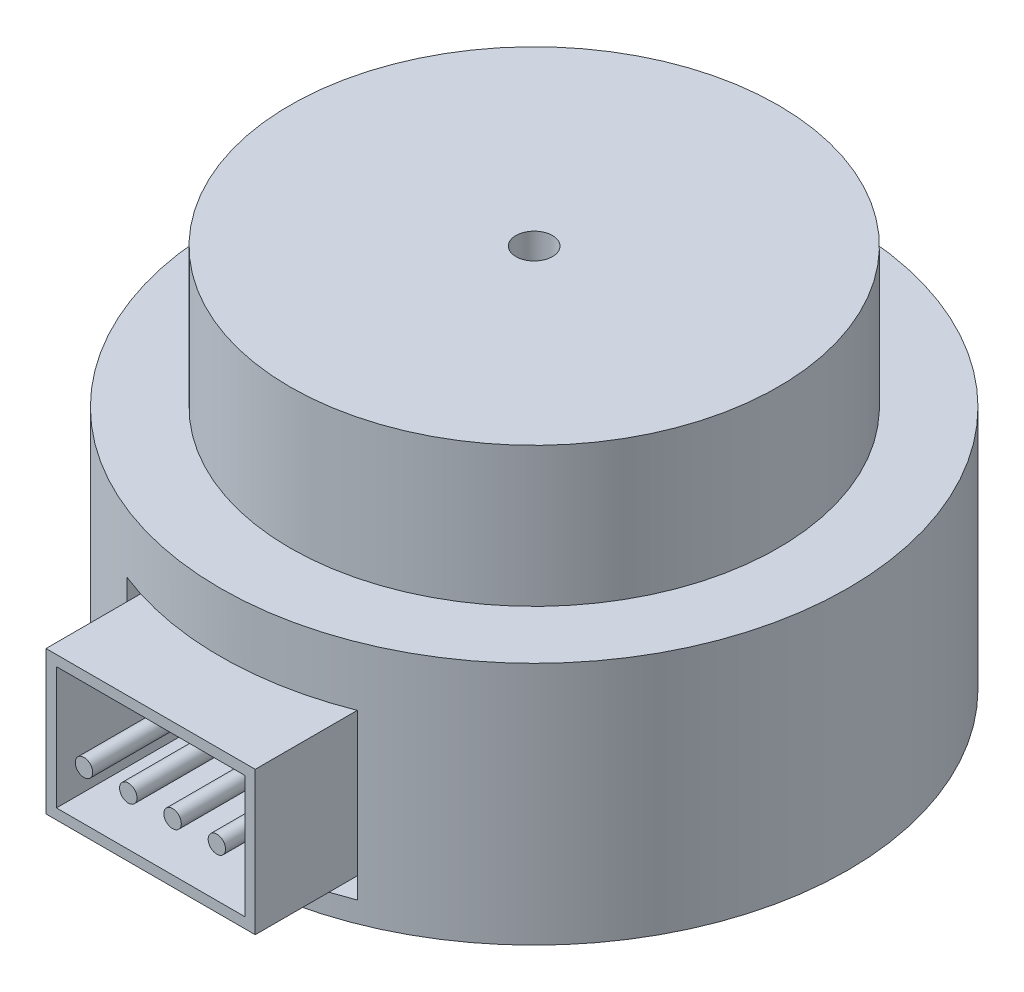
ISO-10303-21;
HEADER;
FILE_DESCRIPTION(('STEP AP214'),'2;1');
FILE_NAME('part.step','',(''),(''),'','','');
FILE_SCHEMA(('AUTOMOTIVE_DESIGN { 1 0 10303 214 1 1 1 1 }'));
ENDSEC;
DATA;
#1=APPLICATION_CONTEXT('core data for automotive mechanical design processes');
#2=APPLICATION_PROTOCOL_DEFINITION('international standard','automotive_design',2000,#1);
#3=PRODUCT_CONTEXT('',#1,'mechanical');
#4=PRODUCT('Part','Part','',(#3));
#5=PRODUCT_RELATED_PRODUCT_CATEGORY('part','',(#4));
#6=PRODUCT_DEFINITION_FORMATION('','',#4);
#7=PRODUCT_DEFINITION_CONTEXT('part definition',#1,'design');
#8=PRODUCT_DEFINITION('design','',#6,#7);
#9=PRODUCT_DEFINITION_SHAPE('','',#8);
#10=(LENGTH_UNIT() NAMED_UNIT(*) SI_UNIT(.MILLI.,.METRE.));
#11=(NAMED_UNIT(*) PLANE_ANGLE_UNIT() SI_UNIT($,.RADIAN.));
#12=(NAMED_UNIT(*) SI_UNIT($,.STERADIAN.) SOLID_ANGLE_UNIT());
#13=UNCERTAINTY_MEASURE_WITH_UNIT(LENGTH_MEASURE(1.E-05),#10,'distance_accuracy_value','');
#14=(GEOMETRIC_REPRESENTATION_CONTEXT(3) GLOBAL_UNCERTAINTY_ASSIGNED_CONTEXT((#13)) GLOBAL_UNIT_ASSIGNED_CONTEXT((#10,
#11,#12)) REPRESENTATION_CONTEXT('',''));
#15=CARTESIAN_POINT('',(0.,0.,0.));
#16=DIRECTION('',(0.,0.,1.));
#17=DIRECTION('',(1.,0.,0.));
#18=AXIS2_PLACEMENT_3D('',#15,#16,#17);
#19=CARTESIAN_POINT('',(-3.,0.895344867581731,11.));
#20=DIRECTION('',(0.,0.,1.));
#21=DIRECTION('',(1.,0.,0.));
#22=AXIS2_PLACEMENT_3D('',#19,#20,#21);
#23=PLANE('',#22);
#24=DIRECTION('',(0.,-1.,0.));
#25=VECTOR('',#24,1.);
#26=CARTESIAN_POINT('',(-3.,5.00490837038475,11.));
#27=LINE('',#26,#25);
#28=CARTESIAN_POINT('',(-3.,5.00490837038475,11.));
#29=VERTEX_POINT('',#28);
#30=CARTESIAN_POINT('',(-3.,0.895344867581731,11.));
#31=VERTEX_POINT('',#30);
#32=EDGE_CURVE('E257',#29,#31,#27,.T.);
#33=ORIENTED_EDGE('',*,*,#32,.T.);
#34=DIRECTION('',(1.,0.,0.));
#35=VECTOR('',#34,1.);
#36=CARTESIAN_POINT('',(-3.,0.895344867581731,11.));
#37=LINE('',#36,#35);
#38=CARTESIAN_POINT('',(3.,0.895344867581731,11.));
#39=VERTEX_POINT('',#38);
#40=EDGE_CURVE('E260',#31,#39,#37,.T.);
#41=ORIENTED_EDGE('',*,*,#40,.T.);
#42=DIRECTION('',(0.,1.,0.));
#43=VECTOR('',#42,1.);
#44=CARTESIAN_POINT('',(3.,5.00490837038475,11.));
#45=LINE('',#44,#43);
#46=CARTESIAN_POINT('',(3.,5.00490837038475,11.));
#47=VERTEX_POINT('',#46);
#48=EDGE_CURVE('E263',#39,#47,#45,.T.);
#49=ORIENTED_EDGE('',*,*,#48,.T.);
#50=DIRECTION('',(-1.,0.,0.));
#51=VECTOR('',#50,1.);
#52=CARTESIAN_POINT('',(-3.,5.00490837038475,11.));
#53=LINE('',#52,#51);
#54=EDGE_CURVE('E266',#47,#29,#53,.T.);
#55=ORIENTED_EDGE('',*,*,#54,.T.);
#56=EDGE_LOOP('',(#33,#41,#49,#55));
#57=FACE_BOUND('',#56,.T.);
#58=DIRECTION('',(1.,0.,0.));
#59=VECTOR('',#58,1.);
#60=CARTESIAN_POINT('',(0.,1.19534486758173,11.));
#61=LINE('',#60,#59);
#62=CARTESIAN_POINT('',(-2.7,1.19534486758173,11.));
#63=VERTEX_POINT('',#62);
#64=CARTESIAN_POINT('',(2.7,1.19534486758173,11.));
#65=VERTEX_POINT('',#64);
#66=EDGE_CURVE('E216',#63,#65,#61,.T.);
#67=ORIENTED_EDGE('',*,*,#66,.F.);
#68=DIRECTION('',(0.,-1.,0.));
#69=VECTOR('',#68,1.);
#70=CARTESIAN_POINT('',(-2.7,-3.49785425684121,11.));
#71=LINE('',#70,#69);
#72=CARTESIAN_POINT('',(-2.7,4.70490837038475,11.));
#73=VERTEX_POINT('',#72);
#74=EDGE_CURVE('E176',#73,#63,#71,.T.);
#75=ORIENTED_EDGE('',*,*,#74,.F.);
#76=DIRECTION('',(1.,0.,0.));
#77=VECTOR('',#76,1.);
#78=CARTESIAN_POINT('',(0.,4.70490837038475,11.));
#79=LINE('',#78,#77);
#80=CARTESIAN_POINT('',(2.7,4.70490837038475,11.));
#81=VERTEX_POINT('',#80);
#82=EDGE_CURVE('E219',#73,#81,#79,.T.);
#83=ORIENTED_EDGE('',*,*,#82,.T.);
#84=DIRECTION('',(0.,-1.,0.));
#85=VECTOR('',#84,1.);
#86=CARTESIAN_POINT('',(2.7,-3.49785425684121,11.));
#87=LINE('',#86,#85);
#88=EDGE_CURVE('E95',#81,#65,#87,.T.);
#89=ORIENTED_EDGE('',*,*,#88,.T.);
#90=EDGE_LOOP('',(#67,#75,#83,#89));
#91=FACE_BOUND('',#90,.T.);
#92=ADVANCED_FACE('F80',(#57,#91),#23,.T.);
#93=CARTESIAN_POINT('',(0.,0.,0.));
#94=DIRECTION('',(0.,-1.,0.));
#95=DIRECTION('',(0.,0.,-1.));
#96=AXIS2_PLACEMENT_3D('',#93,#94,#95);
#97=CYLINDRICAL_SURFACE('',#96,9.);
#98=CARTESIAN_POINT('',(0.,5.30490837038475,0.));
#99=DIRECTION('',(0.,1.,0.));
#100=DIRECTION('',(0.,0.,1.));
#101=AXIS2_PLACEMENT_3D('',#98,#99,#100);
#102=CIRCLE('',#101,9.);
#103=CARTESIAN_POINT('',(-3.3,5.30490837038475,8.37317144217172));
#104=VERTEX_POINT('',#103);
#105=CARTESIAN_POINT('',(3.3,5.30490837038475,8.37317144217172));
#106=VERTEX_POINT('',#105);
#107=EDGE_CURVE('E88',#104,#106,#102,.T.);
#108=ORIENTED_EDGE('',*,*,#107,.T.);
#109=DIRECTION('',(0.,-1.,0.));
#110=VECTOR('',#109,1.);
#111=CARTESIAN_POINT('',(3.3,0.,8.37317144217172));
#112=LINE('',#111,#110);
#113=CARTESIAN_POINT('',(3.3,0.595344867581731,8.37317144217172));
#114=VERTEX_POINT('',#113);
#115=EDGE_CURVE('E12',#106,#114,#112,.T.);
#116=ORIENTED_EDGE('',*,*,#115,.T.);
#117=CARTESIAN_POINT('',(0.,0.595344867581731,0.));
#118=DIRECTION('',(0.,1.,0.));
#119=DIRECTION('',(0.,0.,1.));
#120=AXIS2_PLACEMENT_3D('',#117,#118,#119);
#121=CIRCLE('',#120,9.);
#122=CARTESIAN_POINT('',(-3.3,0.595344867581731,8.37317144217172));
#123=VERTEX_POINT('',#122);
#124=EDGE_CURVE('E301',#123,#114,#121,.T.);
#125=ORIENTED_EDGE('',*,*,#124,.F.);
#126=DIRECTION('',(0.,-1.,0.));
#127=VECTOR('',#126,1.);
#128=CARTESIAN_POINT('',(-3.3,0.,8.37317144217172));
#129=LINE('',#128,#127);
#130=EDGE_CURVE('E303',#104,#123,#129,.T.);
#131=ORIENTED_EDGE('',*,*,#130,.F.);
#132=EDGE_LOOP('',(#108,#116,#125,#131));
#133=FACE_BOUND('',#132,.T.);
#134=CARTESIAN_POINT('',(0.,0.,0.));
#135=DIRECTION('',(0.,-1.,0.));
#136=DIRECTION('',(0.,0.,-1.));
#137=AXIS2_PLACEMENT_3D('',#134,#135,#136);
#138=CIRCLE('',#137,9.);
#139=CARTESIAN_POINT('',(0.,0.,-9.));
#140=VERTEX_POINT('',#139);
#141=EDGE_CURVE('E298',#140,#140,#138,.T.);
#142=ORIENTED_EDGE('',*,*,#141,.F.);
#143=EDGE_LOOP('',(#142));
#144=FACE_BOUND('',#143,.T.);
#145=CARTESIAN_POINT('',(0.,6.99999999999999,0.));
#146=DIRECTION('',(0.,-1.,0.));
#147=DIRECTION('',(0.,0.,-1.));
#148=AXIS2_PLACEMENT_3D('',#145,#146,#147);
#149=CIRCLE('',#148,9.);
#150=CARTESIAN_POINT('',(0.,6.99999999999999,-9.));
#151=VERTEX_POINT('',#150);
#152=EDGE_CURVE('E272',#151,#151,#149,.T.);
#153=ORIENTED_EDGE('',*,*,#152,.T.);
#154=EDGE_LOOP('',(#153));
#155=FACE_BOUND('',#154,.T.);
#156=ADVANCED_FACE('F82',(#133,#144,#155),#97,.T.);
#157=CARTESIAN_POINT('',(-4.5,0.,0.));
#158=DIRECTION('',(0.,1.,0.));
#159=DIRECTION('',(0.,0.,1.));
#160=AXIS2_PLACEMENT_3D('',#157,#158,#159);
#161=PLANE('',#160);
#162=CARTESIAN_POINT('',(0.,0.,0.));
#163=DIRECTION('',(0.,-1.,0.));
#164=DIRECTION('',(0.,0.,-1.));
#165=AXIS2_PLACEMENT_3D('',#162,#163,#164);
#166=CIRCLE('',#165,4.5);
#167=CARTESIAN_POINT('',(0.,0.,-4.5));
#168=VERTEX_POINT('',#167);
#169=EDGE_CURVE('E295',#168,#168,#166,.T.);
#170=ORIENTED_EDGE('',*,*,#169,.F.);
#171=EDGE_LOOP('',(#170));
#172=FACE_BOUND('',#171,.T.);
#173=ORIENTED_EDGE('',*,*,#141,.T.);
#174=EDGE_LOOP('',(#173));
#175=FACE_BOUND('',#174,.T.);
#176=ADVANCED_FACE('F344',(#172,#175),#161,.F.);
#177=CARTESIAN_POINT('',(0.,0.,0.));
#178=DIRECTION('',(0.,-1.,0.));
#179=DIRECTION('',(0.,0.,-1.));
#180=AXIS2_PLACEMENT_3D('',#177,#178,#179);
#181=CYLINDRICAL_SURFACE('',#180,4.5);
#182=CARTESIAN_POINT('',(0.,2.99999999999999,0.));
#183=DIRECTION('',(0.,-1.,0.));
#184=DIRECTION('',(0.,0.,-1.));
#185=AXIS2_PLACEMENT_3D('',#182,#183,#184);
#186=CIRCLE('',#185,4.5);
#187=CARTESIAN_POINT('',(0.,2.99999999999999,-4.5));
#188=VERTEX_POINT('',#187);
#189=EDGE_CURVE('E292',#188,#188,#186,.T.);
#190=ORIENTED_EDGE('',*,*,#189,.F.);
#191=EDGE_LOOP('',(#190));
#192=FACE_BOUND('',#191,.T.);
#193=ORIENTED_EDGE('',*,*,#169,.T.);
#194=EDGE_LOOP('',(#193));
#195=FACE_BOUND('',#194,.T.);
#196=ADVANCED_FACE('F674',(#192,#195),#181,.F.);
#197=CARTESIAN_POINT('',(-0.525,2.99999999999999,0.));
#198=DIRECTION('',(0.,1.,0.));
#199=DIRECTION('',(0.,0.,1.));
#200=AXIS2_PLACEMENT_3D('',#197,#198,#199);
#201=PLANE('',#200);
#202=CARTESIAN_POINT('',(0.,3.,0.));
#203=DIRECTION('',(0.,-1.,0.));
#204=DIRECTION('',(0.,0.,-1.));
#205=AXIS2_PLACEMENT_3D('',#202,#203,#204);
#206=CIRCLE('',#205,0.525);
#207=CARTESIAN_POINT('',(0.,3.,-0.525));
#208=VERTEX_POINT('',#207);
#209=EDGE_CURVE('E289',#208,#208,#206,.T.);
#210=ORIENTED_EDGE('',*,*,#209,.F.);
#211=EDGE_LOOP('',(#210));
#212=FACE_BOUND('',#211,.T.);
#213=ORIENTED_EDGE('',*,*,#189,.T.);
#214=EDGE_LOOP('',(#213));
#215=FACE_BOUND('',#214,.T.);
#216=ADVANCED_FACE('F664',(#212,#215),#201,.F.);
#217=CARTESIAN_POINT('',(0.,0.,0.));
#218=DIRECTION('',(0.,-1.,0.));
#219=DIRECTION('',(0.,0.,-1.));
#220=AXIS2_PLACEMENT_3D('',#217,#218,#219);
#221=CYLINDRICAL_SURFACE('',#220,0.525);
#222=CARTESIAN_POINT('',(0.,11.,0.));
#223=DIRECTION('',(0.,-1.,0.));
#224=DIRECTION('',(0.,0.,-1.));
#225=AXIS2_PLACEMENT_3D('',#222,#223,#224);
#226=CIRCLE('',#225,0.525);
#227=CARTESIAN_POINT('',(0.,11.,-0.525));
#228=VERTEX_POINT('',#227);
#229=EDGE_CURVE('E286',#228,#228,#226,.T.);
#230=ORIENTED_EDGE('',*,*,#229,.F.);
#231=EDGE_LOOP('',(#230));
#232=FACE_BOUND('',#231,.T.);
#233=ORIENTED_EDGE('',*,*,#209,.T.);
#234=EDGE_LOOP('',(#233));
#235=FACE_BOUND('',#234,.T.);
#236=ADVANCED_FACE('F655',(#232,#235),#221,.F.);
#237=CARTESIAN_POINT('',(-7.,11.,0.));
#238=DIRECTION('',(0.,-1.,0.));
#239=DIRECTION('',(0.,0.,-1.));
#240=AXIS2_PLACEMENT_3D('',#237,#238,#239);
#241=PLANE('',#240);
#242=CARTESIAN_POINT('',(0.,11.,0.));
#243=DIRECTION('',(0.,-1.,0.));
#244=DIRECTION('',(0.,0.,-1.));
#245=AXIS2_PLACEMENT_3D('',#242,#243,#244);
#246=CIRCLE('',#245,7.);
#247=CARTESIAN_POINT('',(0.,11.,-7.));
#248=VERTEX_POINT('',#247);
#249=EDGE_CURVE('E283',#248,#248,#246,.T.);
#250=ORIENTED_EDGE('',*,*,#249,.F.);
#251=EDGE_LOOP('',(#250));
#252=FACE_BOUND('',#251,.T.);
#253=ORIENTED_EDGE('',*,*,#229,.T.);
#254=EDGE_LOOP('',(#253));
#255=FACE_BOUND('',#254,.T.);
#256=ADVANCED_FACE('F645',(#252,#255),#241,.F.);
#257=CARTESIAN_POINT('',(0.,0.,0.));
#258=DIRECTION('',(0.,-1.,0.));
#259=DIRECTION('',(0.,0.,-1.));
#260=AXIS2_PLACEMENT_3D('',#257,#258,#259);
#261=CYLINDRICAL_SURFACE('',#260,7.);
#262=CARTESIAN_POINT('',(0.,6.99999999999999,0.));
#263=DIRECTION('',(0.,-1.,0.));
#264=DIRECTION('',(0.,0.,-1.));
#265=AXIS2_PLACEMENT_3D('',#262,#263,#264);
#266=CIRCLE('',#265,7.);
#267=CARTESIAN_POINT('',(0.,6.99999999999999,-7.));
#268=VERTEX_POINT('',#267);
#269=EDGE_CURVE('E280',#268,#268,#266,.T.);
#270=ORIENTED_EDGE('',*,*,#269,.F.);
#271=EDGE_LOOP('',(#270));
#272=FACE_BOUND('',#271,.T.);
#273=ORIENTED_EDGE('',*,*,#249,.T.);
#274=EDGE_LOOP('',(#273));
#275=FACE_BOUND('',#274,.T.);
#276=ADVANCED_FACE('F333',(#272,#275),#261,.T.);
#277=CARTESIAN_POINT('',(-7.,6.99999999999999,0.));
#278=DIRECTION('',(0.,-1.,0.));
#279=DIRECTION('',(0.,0.,-1.));
#280=AXIS2_PLACEMENT_3D('',#277,#278,#279);
#281=PLANE('',#280);
#282=ORIENTED_EDGE('',*,*,#152,.F.);
#283=EDGE_LOOP('',(#282));
#284=FACE_BOUND('',#283,.T.);
#285=ORIENTED_EDGE('',*,*,#269,.T.);
#286=EDGE_LOOP('',(#285));
#287=FACE_BOUND('',#286,.T.);
#288=ADVANCED_FACE('F326',(#284,#287),#281,.F.);
#289=CARTESIAN_POINT('',(3.3,-3.49785425684121,11.));
#290=DIRECTION('',(1.,0.,0.));
#291=DIRECTION('',(0.,1.,0.));
#292=AXIS2_PLACEMENT_3D('',#289,#290,#291);
#293=PLANE('',#292);
#294=DIRECTION('',(0.,0.,-1.));
#295=VECTOR('',#294,1.);
#296=CARTESIAN_POINT('',(3.3,5.30490837038475,11.));
#297=LINE('',#296,#295);
#298=CARTESIAN_POINT('',(3.3,5.30490837038475,7.));
#299=VERTEX_POINT('',#298);
#300=EDGE_CURVE('E255',#106,#299,#297,.T.);
#301=ORIENTED_EDGE('',*,*,#300,.T.);
#302=DIRECTION('',(0.,-1.,0.));
#303=VECTOR('',#302,1.);
#304=CARTESIAN_POINT('',(3.3,-3.49785425684121,7.));
#305=LINE('',#304,#303);
#306=CARTESIAN_POINT('',(3.3,0.595344867581731,7.));
#307=VERTEX_POINT('',#306);
#308=EDGE_CURVE('E179',#299,#307,#305,.T.);
#309=ORIENTED_EDGE('',*,*,#308,.T.);
#310=DIRECTION('',(0.,0.,-1.));
#311=VECTOR('',#310,1.);
#312=CARTESIAN_POINT('',(3.3,0.595344867581731,11.));
#313=LINE('',#312,#311);
#314=EDGE_CURVE('E250',#114,#307,#313,.T.);
#315=ORIENTED_EDGE('',*,*,#314,.F.);
#316=ORIENTED_EDGE('',*,*,#115,.F.);
#317=EDGE_LOOP('',(#301,#309,#315,#316));
#318=FACE_BOUND('',#317,.T.);
#319=ADVANCED_FACE('F324',(#318),#293,.F.);
#320=CARTESIAN_POINT('',(0.,5.30490837038475,11.));
#321=DIRECTION('',(0.,1.,0.));
#322=DIRECTION('',(0.,0.,1.));
#323=AXIS2_PLACEMENT_3D('',#320,#321,#322);
#324=PLANE('',#323);
#325=DIRECTION('',(0.,0.,-1.));
#326=VECTOR('',#325,1.);
#327=CARTESIAN_POINT('',(-3.3,5.30490837038475,11.));
#328=LINE('',#327,#326);
#329=CARTESIAN_POINT('',(-3.3,5.30490837038475,7.));
#330=VERTEX_POINT('',#329);
#331=EDGE_CURVE('E253',#104,#330,#328,.T.);
#332=ORIENTED_EDGE('',*,*,#331,.T.);
#333=DIRECTION('',(1.,0.,0.));
#334=VECTOR('',#333,1.);
#335=CARTESIAN_POINT('',(0.,5.30490837038475,7.));
#336=LINE('',#335,#334);
#337=EDGE_CURVE('E229',#330,#299,#336,.T.);
#338=ORIENTED_EDGE('',*,*,#337,.T.);
#339=ORIENTED_EDGE('',*,*,#300,.F.);
#340=ORIENTED_EDGE('',*,*,#107,.F.);
#341=EDGE_LOOP('',(#332,#338,#339,#340));
#342=FACE_BOUND('',#341,.T.);
#343=ADVANCED_FACE('F312',(#342),#324,.F.);
#344=CARTESIAN_POINT('',(-3.3,-3.49785425684121,11.));
#345=DIRECTION('',(1.,0.,0.));
#346=DIRECTION('',(0.,1.,0.));
#347=AXIS2_PLACEMENT_3D('',#344,#345,#346);
#348=PLANE('',#347);
#349=ORIENTED_EDGE('',*,*,#130,.T.);
#350=DIRECTION('',(0.,0.,-1.));
#351=VECTOR('',#350,1.);
#352=CARTESIAN_POINT('',(-3.3,0.595344867581731,11.));
#353=LINE('',#352,#351);
#354=CARTESIAN_POINT('',(-3.3,0.595344867581731,7.));
#355=VERTEX_POINT('',#354);
#356=EDGE_CURVE('E103',#123,#355,#353,.T.);
#357=ORIENTED_EDGE('',*,*,#356,.T.);
#358=DIRECTION('',(0.,-1.,0.));
#359=VECTOR('',#358,1.);
#360=CARTESIAN_POINT('',(-3.3,-3.49785425684121,7.));
#361=LINE('',#360,#359);
#362=EDGE_CURVE('E232',#330,#355,#361,.T.);
#363=ORIENTED_EDGE('',*,*,#362,.F.);
#364=ORIENTED_EDGE('',*,*,#331,.F.);
#365=EDGE_LOOP('',(#349,#357,#363,#364));
#366=FACE_BOUND('',#365,.T.);
#367=ADVANCED_FACE('F316',(#366),#348,.T.);
#368=CARTESIAN_POINT('',(0.,0.595344867581731,11.));
#369=DIRECTION('',(0.,1.,0.));
#370=DIRECTION('',(0.,0.,1.));
#371=AXIS2_PLACEMENT_3D('',#368,#369,#370);
#372=PLANE('',#371);
#373=ORIENTED_EDGE('',*,*,#124,.T.);
#374=ORIENTED_EDGE('',*,*,#314,.T.);
#375=DIRECTION('',(1.,0.,0.));
#376=VECTOR('',#375,1.);
#377=CARTESIAN_POINT('',(0.,0.595344867581731,7.));
#378=LINE('',#377,#376);
#379=EDGE_CURVE('E235',#355,#307,#378,.T.);
#380=ORIENTED_EDGE('',*,*,#379,.F.);
#381=ORIENTED_EDGE('',*,*,#356,.F.);
#382=EDGE_LOOP('',(#373,#374,#380,#381));
#383=FACE_BOUND('',#382,.T.);
#384=ADVANCED_FACE('F321',(#383),#372,.T.);
#385=CARTESIAN_POINT('',(0.,-3.49785425684121,7.));
#386=DIRECTION('',(0.,0.,1.));
#387=DIRECTION('',(1.,0.,0.));
#388=AXIS2_PLACEMENT_3D('',#385,#386,#387);
#389=PLANE('',#388);
#390=ORIENTED_EDGE('',*,*,#308,.F.);
#391=ORIENTED_EDGE('',*,*,#337,.F.);
#392=ORIENTED_EDGE('',*,*,#362,.T.);
#393=ORIENTED_EDGE('',*,*,#379,.T.);
#394=EDGE_LOOP('',(#390,#391,#392,#393));
#395=FACE_BOUND('',#394,.T.);
#396=DIRECTION('',(1.,0.,0.));
#397=VECTOR('',#396,1.);
#398=CARTESIAN_POINT('',(0.,5.00490837038475,7.));
#399=LINE('',#398,#397);
#400=CARTESIAN_POINT('',(-3.,5.00490837038475,7.));
#401=VERTEX_POINT('',#400);
#402=CARTESIAN_POINT('',(3.,5.00490837038475,7.));
#403=VERTEX_POINT('',#402);
#404=EDGE_CURVE('E238',#401,#403,#399,.T.);
#405=ORIENTED_EDGE('',*,*,#404,.T.);
#406=DIRECTION('',(0.,-1.,0.));
#407=VECTOR('',#406,1.);
#408=CARTESIAN_POINT('',(3.,-3.49785425684121,7.));
#409=LINE('',#408,#407);
#410=CARTESIAN_POINT('',(3.,0.895344867581731,7.));
#411=VERTEX_POINT('',#410);
#412=EDGE_CURVE('E241',#403,#411,#409,.T.);
#413=ORIENTED_EDGE('',*,*,#412,.T.);
#414=DIRECTION('',(1.,0.,0.));
#415=VECTOR('',#414,1.);
#416=CARTESIAN_POINT('',(0.,0.895344867581731,7.));
#417=LINE('',#416,#415);
#418=CARTESIAN_POINT('',(-3.,0.895344867581731,7.));
#419=VERTEX_POINT('',#418);
#420=EDGE_CURVE('E244',#419,#411,#417,.T.);
#421=ORIENTED_EDGE('',*,*,#420,.F.);
#422=DIRECTION('',(0.,-1.,0.));
#423=VECTOR('',#422,1.);
#424=CARTESIAN_POINT('',(-3.,-3.49785425684121,7.));
#425=LINE('',#424,#423);
#426=EDGE_CURVE('E247',#401,#419,#425,.T.);
#427=ORIENTED_EDGE('',*,*,#426,.F.);
#428=EDGE_LOOP('',(#405,#413,#421,#427));
#429=FACE_BOUND('',#428,.T.);
#430=ADVANCED_FACE('F319',(#395,#429),#389,.T.);
#431=CARTESIAN_POINT('',(-3.,5.00490837038475,8.471249));
#432=DIRECTION('',(-1.,0.,0.));
#433=DIRECTION('',(0.,-1.,0.));
#434=AXIS2_PLACEMENT_3D('',#431,#432,#433);
#435=PLANE('',#434);
#436=DIRECTION('',(0.,0.,1.));
#437=VECTOR('',#436,1.);
#438=CARTESIAN_POINT('',(-3.,5.00490837038475,8.471249));
#439=LINE('',#438,#437);
#440=EDGE_CURVE('E270',#401,#29,#439,.T.);
#441=ORIENTED_EDGE('',*,*,#440,.F.);
#442=ORIENTED_EDGE('',*,*,#426,.T.);
#443=DIRECTION('',(0.,0.,1.));
#444=VECTOR('',#443,1.);
#445=CARTESIAN_POINT('',(-3.,0.895344867581731,8.471249));
#446=LINE('',#445,#444);
#447=EDGE_CURVE('E269',#419,#31,#446,.T.);
#448=ORIENTED_EDGE('',*,*,#447,.T.);
#449=ORIENTED_EDGE('',*,*,#32,.F.);
#450=EDGE_LOOP('',(#441,#442,#448,#449));
#451=FACE_BOUND('',#450,.T.);
#452=ADVANCED_FACE('F406',(#451),#435,.T.);
#453=CARTESIAN_POINT('',(-3.,0.895344867581731,8.471249));
#454=DIRECTION('',(0.,-1.,0.));
#455=DIRECTION('',(0.,0.,-1.));
#456=AXIS2_PLACEMENT_3D('',#453,#454,#455);
#457=PLANE('',#456);
#458=ORIENTED_EDGE('',*,*,#447,.F.);
#459=ORIENTED_EDGE('',*,*,#420,.T.);
#460=DIRECTION('',(0.,0.,1.));
#461=VECTOR('',#460,1.);
#462=CARTESIAN_POINT('',(3.,0.895344867581731,8.471249));
#463=LINE('',#462,#461);
#464=EDGE_CURVE('E275',#411,#39,#463,.T.);
#465=ORIENTED_EDGE('',*,*,#464,.T.);
#466=ORIENTED_EDGE('',*,*,#40,.F.);
#467=EDGE_LOOP('',(#458,#459,#465,#466));
#468=FACE_BOUND('',#467,.T.);
#469=ADVANCED_FACE('F429',(#468),#457,.T.);
#470=CARTESIAN_POINT('',(3.,5.00490837038475,8.471249));
#471=DIRECTION('',(1.,0.,0.));
#472=DIRECTION('',(0.,1.,0.));
#473=AXIS2_PLACEMENT_3D('',#470,#471,#472);
#474=PLANE('',#473);
#475=ORIENTED_EDGE('',*,*,#464,.F.);
#476=ORIENTED_EDGE('',*,*,#412,.F.);
#477=DIRECTION('',(0.,0.,1.));
#478=VECTOR('',#477,1.);
#479=CARTESIAN_POINT('',(3.,5.00490837038475,8.471249));
#480=LINE('',#479,#478);
#481=EDGE_CURVE('E273',#403,#47,#480,.T.);
#482=ORIENTED_EDGE('',*,*,#481,.T.);
#483=ORIENTED_EDGE('',*,*,#48,.F.);
#484=EDGE_LOOP('',(#475,#476,#482,#483));
#485=FACE_BOUND('',#484,.T.);
#486=ADVANCED_FACE('F439',(#485),#474,.T.);
#487=CARTESIAN_POINT('',(-3.,5.00490837038475,8.471249));
#488=DIRECTION('',(0.,1.,0.));
#489=DIRECTION('',(-1.,0.,0.));
#490=AXIS2_PLACEMENT_3D('',#487,#488,#489);
#491=PLANE('',#490);
#492=ORIENTED_EDGE('',*,*,#481,.F.);
#493=ORIENTED_EDGE('',*,*,#404,.F.);
#494=ORIENTED_EDGE('',*,*,#440,.T.);
#495=ORIENTED_EDGE('',*,*,#54,.F.);
#496=EDGE_LOOP('',(#492,#493,#494,#495));
#497=FACE_BOUND('',#496,.T.);
#498=ADVANCED_FACE('F448',(#497),#491,.T.);
#499=CARTESIAN_POINT('',(-2.7,-3.49785425684121,11.));
#500=DIRECTION('',(1.,0.,0.));
#501=DIRECTION('',(0.,1.,0.));
#502=AXIS2_PLACEMENT_3D('',#499,#500,#501);
#503=PLANE('',#502);
#504=DIRECTION('',(0.,0.,-1.));
#505=VECTOR('',#504,1.);
#506=CARTESIAN_POINT('',(-2.7,4.70490837038475,11.));
#507=LINE('',#506,#505);
#508=CARTESIAN_POINT('',(-2.7,4.70490837038475,7.));
#509=VERTEX_POINT('',#508);
#510=EDGE_CURVE('E222',#73,#509,#507,.T.);
#511=ORIENTED_EDGE('',*,*,#510,.F.);
#512=ORIENTED_EDGE('',*,*,#74,.T.);
#513=DIRECTION('',(0.,0.,-1.));
#514=VECTOR('',#513,1.);
#515=CARTESIAN_POINT('',(-2.7,1.19534486758173,11.));
#516=LINE('',#515,#514);
#517=CARTESIAN_POINT('',(-2.7,1.19534486758173,7.));
#518=VERTEX_POINT('',#517);
#519=EDGE_CURVE('E170',#63,#518,#516,.T.);
#520=ORIENTED_EDGE('',*,*,#519,.T.);
#521=DIRECTION('',(0.,-1.,0.));
#522=VECTOR('',#521,1.);
#523=CARTESIAN_POINT('',(-2.7,-3.49785425684121,7.));
#524=LINE('',#523,#522);
#525=EDGE_CURVE('E174',#509,#518,#524,.T.);
#526=ORIENTED_EDGE('',*,*,#525,.F.);
#527=EDGE_LOOP('',(#511,#512,#520,#526));
#528=FACE_BOUND('',#527,.T.);
#529=ADVANCED_FACE('F172',(#528),#503,.T.);
#530=CARTESIAN_POINT('',(0.,1.19534486758173,11.));
#531=DIRECTION('',(0.,1.,0.));
#532=DIRECTION('',(0.,0.,1.));
#533=AXIS2_PLACEMENT_3D('',#530,#531,#532);
#534=PLANE('',#533);
#535=ORIENTED_EDGE('',*,*,#519,.F.);
#536=ORIENTED_EDGE('',*,*,#66,.T.);
#537=DIRECTION('',(0.,0.,-1.));
#538=VECTOR('',#537,1.);
#539=CARTESIAN_POINT('',(2.7,1.19534486758173,11.));
#540=LINE('',#539,#538);
#541=CARTESIAN_POINT('',(2.7,1.19534486758173,7.));
#542=VERTEX_POINT('',#541);
#543=EDGE_CURVE('E180',#65,#542,#540,.T.);
#544=ORIENTED_EDGE('',*,*,#543,.T.);
#545=DIRECTION('',(1.,0.,0.));
#546=VECTOR('',#545,1.);
#547=CARTESIAN_POINT('',(0.,1.19534486758173,7.));
#548=LINE('',#547,#546);
#549=EDGE_CURVE('E183',#518,#542,#548,.T.);
#550=ORIENTED_EDGE('',*,*,#549,.F.);
#551=EDGE_LOOP('',(#535,#536,#544,#550));
#552=FACE_BOUND('',#551,.T.);
#553=ADVANCED_FACE('F184',(#552),#534,.T.);
#554=CARTESIAN_POINT('',(2.7,-3.49785425684121,11.));
#555=DIRECTION('',(1.,0.,0.));
#556=DIRECTION('',(0.,0.,-1.));
#557=AXIS2_PLACEMENT_3D('',#554,#555,#556);
#558=PLANE('',#557);
#559=ORIENTED_EDGE('',*,*,#543,.F.);
#560=ORIENTED_EDGE('',*,*,#88,.F.);
#561=DIRECTION('',(0.,0.,-1.));
#562=VECTOR('',#561,1.);
#563=CARTESIAN_POINT('',(2.7,4.70490837038475,11.));
#564=LINE('',#563,#562);
#565=CARTESIAN_POINT('',(2.7,4.70490837038475,7.));
#566=VERTEX_POINT('',#565);
#567=EDGE_CURVE('E224',#81,#566,#564,.T.);
#568=ORIENTED_EDGE('',*,*,#567,.T.);
#569=DIRECTION('',(0.,-1.,0.));
#570=VECTOR('',#569,1.);
#571=CARTESIAN_POINT('',(2.7,-3.49785425684121,7.));
#572=LINE('',#571,#570);
#573=EDGE_CURVE('E188',#566,#542,#572,.T.);
#574=ORIENTED_EDGE('',*,*,#573,.T.);
#575=EDGE_LOOP('',(#559,#560,#568,#574));
#576=FACE_BOUND('',#575,.T.);
#577=ADVANCED_FACE('F387',(#576),#558,.F.);
#578=CARTESIAN_POINT('',(1.9,2.59534486758173,11.));
#579=DIRECTION('',(0.,0.,-1.));
#580=DIRECTION('',(-1.,0.,0.));
#581=AXIS2_PLACEMENT_3D('',#578,#579,#580);
#582=CYLINDRICAL_SURFACE('',#581,0.250000000000001);
#583=CARTESIAN_POINT('',(1.9,2.59534486758173,11.));
#584=DIRECTION('',(0.,0.,1.));
#585=DIRECTION('',(1.,0.,0.));
#586=AXIS2_PLACEMENT_3D('',#583,#584,#585);
#587=CIRCLE('',#586,0.250000000000001);
#588=CARTESIAN_POINT('',(2.15,2.59534486758173,11.));
#589=VERTEX_POINT('',#588);
#590=EDGE_CURVE('E212',#589,#589,#587,.T.);
#591=ORIENTED_EDGE('',*,*,#590,.F.);
#592=EDGE_LOOP('',(#591));
#593=FACE_BOUND('',#592,.T.);
#594=CARTESIAN_POINT('',(1.9,2.59534486758173,7.));
#595=DIRECTION('',(0.,0.,1.));
#596=DIRECTION('',(1.,0.,0.));
#597=AXIS2_PLACEMENT_3D('',#594,#595,#596);
#598=CIRCLE('',#597,0.250000000000001);
#599=CARTESIAN_POINT('',(2.15,2.59534486758173,7.));
#600=VERTEX_POINT('',#599);
#601=EDGE_CURVE('E194',#600,#600,#598,.T.);
#602=ORIENTED_EDGE('',*,*,#601,.T.);
#603=EDGE_LOOP('',(#602));
#604=FACE_BOUND('',#603,.T.);
#605=ADVANCED_FACE('F385',(#593,#604),#582,.T.);
#606=CARTESIAN_POINT('',(0.629918035955923,2.59534486758173,11.));
#607=DIRECTION('',(0.,0.,-1.));
#608=DIRECTION('',(-1.,0.,0.));
#609=AXIS2_PLACEMENT_3D('',#606,#607,#608);
#610=CYLINDRICAL_SURFACE('',#609,0.25);
#611=CARTESIAN_POINT('',(0.629918035955923,2.59534486758173,11.));
#612=DIRECTION('',(0.,0.,1.));
#613=DIRECTION('',(1.,0.,0.));
#614=AXIS2_PLACEMENT_3D('',#611,#612,#613);
#615=CIRCLE('',#614,0.25);
#616=CARTESIAN_POINT('',(0.879918035955924,2.59534486758173,11.));
#617=VERTEX_POINT('',#616);
#618=EDGE_CURVE('E209',#617,#617,#615,.T.);
#619=ORIENTED_EDGE('',*,*,#618,.F.);
#620=EDGE_LOOP('',(#619));
#621=FACE_BOUND('',#620,.T.);
#622=CARTESIAN_POINT('',(0.629918035955923,2.59534486758173,7.));
#623=DIRECTION('',(0.,0.,1.));
#624=DIRECTION('',(1.,0.,0.));
#625=AXIS2_PLACEMENT_3D('',#622,#623,#624);
#626=CIRCLE('',#625,0.25);
#627=CARTESIAN_POINT('',(0.879918035955924,2.59534486758173,7.));
#628=VERTEX_POINT('',#627);
#629=EDGE_CURVE('E197',#628,#628,#626,.T.);
#630=ORIENTED_EDGE('',*,*,#629,.T.);
#631=EDGE_LOOP('',(#630));
#632=FACE_BOUND('',#631,.T.);
#633=ADVANCED_FACE('F363',(#621,#632),#610,.T.);
#634=CARTESIAN_POINT('',(-0.640081964044077,2.59534486758173,11.));
#635=DIRECTION('',(0.,0.,-1.));
#636=DIRECTION('',(-1.,0.,0.));
#637=AXIS2_PLACEMENT_3D('',#634,#635,#636);
#638=CYLINDRICAL_SURFACE('',#637,0.25);
#639=CARTESIAN_POINT('',(-0.640081964044077,2.59534486758173,11.));
#640=DIRECTION('',(0.,0.,1.));
#641=DIRECTION('',(1.,0.,0.));
#642=AXIS2_PLACEMENT_3D('',#639,#640,#641);
#643=CIRCLE('',#642,0.25);
#644=CARTESIAN_POINT('',(-0.390081964044076,2.59534486758173,11.));
#645=VERTEX_POINT('',#644);
#646=EDGE_CURVE('E206',#645,#645,#643,.T.);
#647=ORIENTED_EDGE('',*,*,#646,.F.);
#648=EDGE_LOOP('',(#647));
#649=FACE_BOUND('',#648,.T.);
#650=CARTESIAN_POINT('',(-0.640081964044077,2.59534486758173,7.));
#651=DIRECTION('',(0.,0.,1.));
#652=DIRECTION('',(1.,0.,0.));
#653=AXIS2_PLACEMENT_3D('',#650,#651,#652);
#654=CIRCLE('',#653,0.25);
#655=CARTESIAN_POINT('',(-0.390081964044076,2.59534486758173,7.));
#656=VERTEX_POINT('',#655);
#657=EDGE_CURVE('E367',#656,#656,#654,.T.);
#658=ORIENTED_EDGE('',*,*,#657,.T.);
#659=EDGE_LOOP('',(#658));
#660=FACE_BOUND('',#659,.T.);
#661=ADVANCED_FACE('F359',(#649,#660),#638,.T.);
#662=CARTESIAN_POINT('',(-1.91008196404408,2.59534486758173,11.));
#663=DIRECTION('',(0.,0.,-1.));
#664=DIRECTION('',(-1.,0.,0.));
#665=AXIS2_PLACEMENT_3D('',#662,#663,#664);
#666=CYLINDRICAL_SURFACE('',#665,0.25);
#667=CARTESIAN_POINT('',(-1.91008196404408,2.59534486758173,11.));
#668=DIRECTION('',(0.,0.,1.));
#669=DIRECTION('',(1.,0.,0.));
#670=AXIS2_PLACEMENT_3D('',#667,#668,#669);
#671=CIRCLE('',#670,0.25);
#672=CARTESIAN_POINT('',(-1.66008196404408,2.59534486758173,11.));
#673=VERTEX_POINT('',#672);
#674=EDGE_CURVE('E203',#673,#673,#671,.T.);
#675=ORIENTED_EDGE('',*,*,#674,.F.);
#676=EDGE_LOOP('',(#675));
#677=FACE_BOUND('',#676,.T.);
#678=CARTESIAN_POINT('',(-1.91008196404408,2.59534486758173,7.));
#679=DIRECTION('',(0.,0.,1.));
#680=DIRECTION('',(1.,0.,0.));
#681=AXIS2_PLACEMENT_3D('',#678,#679,#680);
#682=CIRCLE('',#681,0.25);
#683=CARTESIAN_POINT('',(-1.66008196404408,2.59534486758173,7.));
#684=VERTEX_POINT('',#683);
#685=EDGE_CURVE('E369',#684,#684,#682,.T.);
#686=ORIENTED_EDGE('',*,*,#685,.T.);
#687=EDGE_LOOP('',(#686));
#688=FACE_BOUND('',#687,.T.);
#689=ADVANCED_FACE('F362',(#677,#688),#666,.T.);
#690=CARTESIAN_POINT('',(0.,4.70490837038475,11.));
#691=DIRECTION('',(0.,1.,0.));
#692=DIRECTION('',(0.,0.,1.));
#693=AXIS2_PLACEMENT_3D('',#690,#691,#692);
#694=PLANE('',#693);
#695=ORIENTED_EDGE('',*,*,#567,.F.);
#696=ORIENTED_EDGE('',*,*,#82,.F.);
#697=ORIENTED_EDGE('',*,*,#510,.T.);
#698=DIRECTION('',(1.,0.,0.));
#699=VECTOR('',#698,1.);
#700=CARTESIAN_POINT('',(0.,4.70490837038475,7.));
#701=LINE('',#700,#699);
#702=EDGE_CURVE('E193',#509,#566,#701,.T.);
#703=ORIENTED_EDGE('',*,*,#702,.T.);
#704=EDGE_LOOP('',(#695,#696,#697,#703));
#705=FACE_BOUND('',#704,.T.);
#706=ADVANCED_FACE('F378',(#705),#694,.F.);
#707=CARTESIAN_POINT('',(0.,-3.49785425684121,7.));
#708=DIRECTION('',(0.,0.,1.));
#709=DIRECTION('',(1.,0.,0.));
#710=AXIS2_PLACEMENT_3D('',#707,#708,#709);
#711=PLANE('',#710);
#712=ORIENTED_EDGE('',*,*,#685,.F.);
#713=EDGE_LOOP('',(#712));
#714=FACE_BOUND('',#713,.T.);
#715=ORIENTED_EDGE('',*,*,#657,.F.);
#716=EDGE_LOOP('',(#715));
#717=FACE_BOUND('',#716,.T.);
#718=ORIENTED_EDGE('',*,*,#629,.F.);
#719=EDGE_LOOP('',(#718));
#720=FACE_BOUND('',#719,.T.);
#721=ORIENTED_EDGE('',*,*,#601,.F.);
#722=EDGE_LOOP('',(#721));
#723=FACE_BOUND('',#722,.T.);
#724=ORIENTED_EDGE('',*,*,#525,.T.);
#725=ORIENTED_EDGE('',*,*,#549,.T.);
#726=ORIENTED_EDGE('',*,*,#573,.F.);
#727=ORIENTED_EDGE('',*,*,#702,.F.);
#728=EDGE_LOOP('',(#724,#725,#726,#727));
#729=FACE_BOUND('',#728,.T.);
#730=ADVANCED_FACE('F191',(#714,#717,#720,#723,#729),#711,.T.);
#731=ORIENTED_EDGE('',*,*,#674,.T.);
#732=EDGE_LOOP('',(#731));
#733=FACE_BOUND('',#732,.T.);
#734=ADVANCED_FACE('F339',(#733),#23,.T.);
#735=ORIENTED_EDGE('',*,*,#646,.T.);
#736=EDGE_LOOP('',(#735));
#737=FACE_BOUND('',#736,.T.);
#738=ADVANCED_FACE('F340',(#737),#23,.T.);
#739=ORIENTED_EDGE('',*,*,#618,.T.);
#740=EDGE_LOOP('',(#739));
#741=FACE_BOUND('',#740,.T.);
#742=ADVANCED_FACE('F351',(#741),#23,.T.);
#743=ORIENTED_EDGE('',*,*,#590,.T.);
#744=EDGE_LOOP('',(#743));
#745=FACE_BOUND('',#744,.T.);
#746=ADVANCED_FACE('F349',(#745),#23,.T.);
#747=CLOSED_SHELL('',(#92,#156,#176,#196,#216,#236,#256,#276,#288,#319,#343,#367,#384,#430,#452,
#469,#486,#498,#529,#553,#577,#605,#633,#661,#689,#706,#730,#734,#738,#742,#746));
#748=MANIFOLD_SOLID_BREP('B2',#747);
#749=ADVANCED_BREP_SHAPE_REPRESENTATION('',(#18,#748),#14);
#750=SHAPE_DEFINITION_REPRESENTATION(#9,#749);
ENDSEC;
END-ISO-10303-21;
